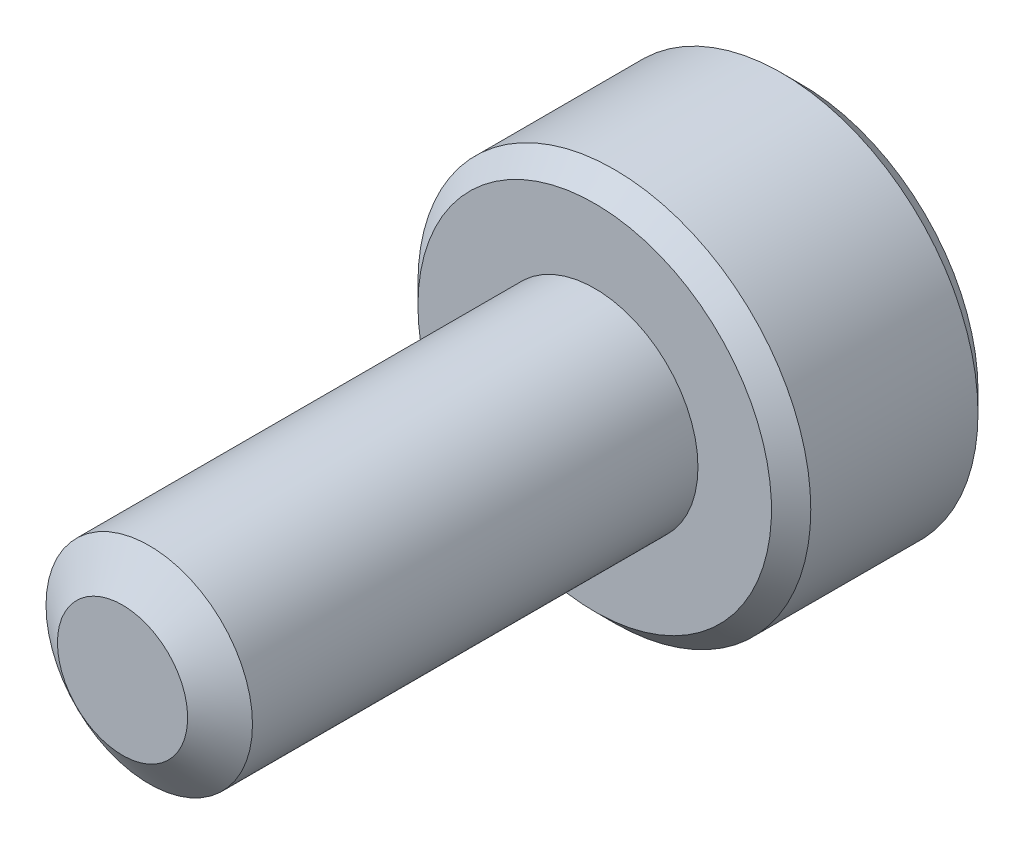
ISO-10303-21;
HEADER;
FILE_DESCRIPTION(('STEP AP214'),'2;1');
FILE_NAME('part.step','',(''),(''),'','','');
FILE_SCHEMA(('AUTOMOTIVE_DESIGN { 1 0 10303 214 1 1 1 1 }'));
ENDSEC;
DATA;
#1=APPLICATION_CONTEXT('core data for automotive mechanical design processes');
#2=APPLICATION_PROTOCOL_DEFINITION('international standard','automotive_design',2000,#1);
#3=PRODUCT_CONTEXT('',#1,'mechanical');
#4=PRODUCT('Part','Part','',(#3));
#5=PRODUCT_RELATED_PRODUCT_CATEGORY('part','',(#4));
#6=PRODUCT_DEFINITION_FORMATION('','',#4);
#7=PRODUCT_DEFINITION_CONTEXT('part definition',#1,'design');
#8=PRODUCT_DEFINITION('design','',#6,#7);
#9=PRODUCT_DEFINITION_SHAPE('','',#8);
#10=(LENGTH_UNIT() NAMED_UNIT(*) SI_UNIT(.MILLI.,.METRE.));
#11=(NAMED_UNIT(*) PLANE_ANGLE_UNIT() SI_UNIT($,.RADIAN.));
#12=(NAMED_UNIT(*) SI_UNIT($,.STERADIAN.) SOLID_ANGLE_UNIT());
#13=UNCERTAINTY_MEASURE_WITH_UNIT(LENGTH_MEASURE(1.E-05),#10,'distance_accuracy_value','');
#14=(GEOMETRIC_REPRESENTATION_CONTEXT(3) GLOBAL_UNCERTAINTY_ASSIGNED_CONTEXT((#13)) GLOBAL_UNIT_ASSIGNED_CONTEXT((#10,
#11,#12)) REPRESENTATION_CONTEXT('',''));
#15=CARTESIAN_POINT('',(0.,0.,0.));
#16=DIRECTION('',(0.,0.,1.));
#17=DIRECTION('',(1.,0.,0.));
#18=AXIS2_PLACEMENT_3D('',#15,#16,#17);
#19=CARTESIAN_POINT('',(0.,0.,-4.1656));
#20=DIRECTION('',(0.,0.,1.));
#21=DIRECTION('',(1.,0.,0.));
#22=AXIS2_PLACEMENT_3D('',#19,#20,#21);
#23=PLANE('',#22);
#24=CARTESIAN_POINT('',(0.,0.,-4.1656));
#25=DIRECTION('',(0.,0.,1.));
#26=DIRECTION('',(1.,0.,0.));
#27=AXIS2_PLACEMENT_3D('',#24,#25,#26);
#28=CIRCLE('',#27,3.56616);
#29=CARTESIAN_POINT('',(3.56616,0.,-4.1656));
#30=VERTEX_POINT('',#29);
#31=EDGE_CURVE('E11',#30,#30,#28,.F.);
#32=ORIENTED_EDGE('',*,*,#31,.T.);
#33=EDGE_LOOP('',(#32));
#34=FACE_BOUND('',#33,.T.);
#35=CARTESIAN_POINT('',(0.,0.,-4.1656));
#36=DIRECTION('',(0.,0.,-1.));
#37=DIRECTION('',(-1.,0.,0.));
#38=AXIS2_PLACEMENT_3D('',#35,#36,#37);
#39=CIRCLE('',#38,2.06222299276169);
#40=CARTESIAN_POINT('',(1.7859375,1.03111149638085,-4.1656));
#41=VERTEX_POINT('',#40);
#42=CARTESIAN_POINT('',(1.7859375,-1.03111149638085,-4.1656));
#43=VERTEX_POINT('',#42);
#44=EDGE_CURVE('E59',#41,#43,#39,.T.);
#45=ORIENTED_EDGE('',*,*,#44,.F.);
#46=CARTESIAN_POINT('',(0.,2.06222299276169,-4.1656));
#47=VERTEX_POINT('',#46);
#48=EDGE_CURVE('E135',#47,#41,#39,.T.);
#49=ORIENTED_EDGE('',*,*,#48,.F.);
#50=CARTESIAN_POINT('',(-1.7859375,1.03111149638085,-4.1656));
#51=VERTEX_POINT('',#50);
#52=EDGE_CURVE('E132',#51,#47,#39,.T.);
#53=ORIENTED_EDGE('',*,*,#52,.F.);
#54=CARTESIAN_POINT('',(-1.7859375,-1.03111149638085,-4.1656));
#55=VERTEX_POINT('',#54);
#56=EDGE_CURVE('E99',#55,#51,#39,.T.);
#57=ORIENTED_EDGE('',*,*,#56,.F.);
#58=CARTESIAN_POINT('',(0.,-2.06222299276169,-4.1656));
#59=VERTEX_POINT('',#58);
#60=EDGE_CURVE('E91',#59,#55,#39,.T.);
#61=ORIENTED_EDGE('',*,*,#60,.F.);
#62=EDGE_CURVE('E52',#43,#59,#39,.T.);
#63=ORIENTED_EDGE('',*,*,#62,.F.);
#64=EDGE_LOOP('',(#45,#49,#53,#57,#61,#63));
#65=FACE_BOUND('',#64,.T.);
#66=ADVANCED_FACE('F38',(#34,#65),#23,.F.);
#67=CARTESIAN_POINT('',(0.,0.,9.525));
#68=DIRECTION('',(0.,0.,-1.));
#69=DIRECTION('',(-1.,0.,0.));
#70=AXIS2_PLACEMENT_3D('',#67,#68,#69);
#71=CYLINDRICAL_SURFACE('',#70,2.0828);
#72=CARTESIAN_POINT('',(0.,0.,8.98615127117986));
#73=DIRECTION('',(0.,0.,-1.));
#74=DIRECTION('',(-1.,0.,0.));
#75=AXIS2_PLACEMENT_3D('',#72,#73,#74);
#76=CIRCLE('',#75,2.0828);
#77=CARTESIAN_POINT('',(-2.0828,0.,8.98615127117986));
#78=VERTEX_POINT('',#77);
#79=EDGE_CURVE('E167',#78,#78,#76,.T.);
#80=CARTESIAN_POINT('',(0.,0.,0.));
#81=DIRECTION('',(0.,0.,1.));
#82=DIRECTION('',(1.,0.,0.));
#83=AXIS2_PLACEMENT_3D('',#80,#81,#82);
#84=CIRCLE('',#83,2.0828);
#85=CARTESIAN_POINT('',(-2.0828,0.,0.));
#86=VERTEX_POINT('',#85);
#87=EDGE_CURVE('E166',#86,#86,#84,.T.);
#88=CARTESIAN_POINT('',(-2.0828,0.,8.98615127117986));
#89=CARTESIAN_POINT('',(-2.0828,0.,8.89254552877174));
#90=CARTESIAN_POINT('',(-2.0828,0.,8.79893978636361));
#91=CARTESIAN_POINT('',(-2.0828,0.,8.61172830154737));
#92=CARTESIAN_POINT('',(-2.0828,0.,8.51812255913924));
#93=CARTESIAN_POINT('',(-2.0828,0.,8.330911074323));
#94=CARTESIAN_POINT('',(-2.0828,0.,8.23730533191487));
#95=CARTESIAN_POINT('',(-2.0828,0.,8.05009384709862));
#96=CARTESIAN_POINT('',(-2.0828,0.,7.9564881046905));
#97=CARTESIAN_POINT('',(-2.0828,0.,7.76927661987425));
#98=CARTESIAN_POINT('',(-2.0828,0.,7.67567087746613));
#99=CARTESIAN_POINT('',(-2.0828,0.,7.48845939264988));
#100=CARTESIAN_POINT('',(-2.0828,0.,7.39485365024176));
#101=CARTESIAN_POINT('',(-2.0828,0.,7.20764216542551));
#102=CARTESIAN_POINT('',(-2.0828,0.,7.11403642301739));
#103=CARTESIAN_POINT('',(-2.0828,0.,6.92682493820114));
#104=CARTESIAN_POINT('',(-2.0828,0.,6.83321919579302));
#105=CARTESIAN_POINT('',(-2.0828,0.,6.64600771097677));
#106=CARTESIAN_POINT('',(-2.0828,0.,6.55240196856865));
#107=CARTESIAN_POINT('',(-2.0828,0.,6.3651904837524));
#108=CARTESIAN_POINT('',(-2.0828,0.,6.27158474134428));
#109=CARTESIAN_POINT('',(-2.0828,0.,6.08437325652803));
#110=CARTESIAN_POINT('',(-2.0828,0.,5.99076751411991));
#111=CARTESIAN_POINT('',(-2.0828,0.,5.80355602930366));
#112=CARTESIAN_POINT('',(-2.0828,0.,5.70995028689554));
#113=CARTESIAN_POINT('',(-2.0828,0.,5.52273880207929));
#114=CARTESIAN_POINT('',(-2.0828,0.,5.42913305967117));
#115=CARTESIAN_POINT('',(-2.0828,0.,5.24192157485492));
#116=CARTESIAN_POINT('',(-2.0828,0.,5.1483158324468));
#117=CARTESIAN_POINT('',(-2.0828,0.,4.96110434763055));
#118=CARTESIAN_POINT('',(-2.0828,0.,4.86749860522242));
#119=CARTESIAN_POINT('',(-2.0828,0.,4.68028712040618));
#120=CARTESIAN_POINT('',(-2.0828,0.,4.58668137799805));
#121=CARTESIAN_POINT('',(-2.0828,0.,4.39946989318181));
#122=CARTESIAN_POINT('',(-2.0828,0.,4.30586415077368));
#123=CARTESIAN_POINT('',(-2.0828,0.,4.11865266595744));
#124=CARTESIAN_POINT('',(-2.0828,0.,4.02504692354931));
#125=CARTESIAN_POINT('',(-2.0828,0.,3.83783543873307));
#126=CARTESIAN_POINT('',(-2.0828,0.,3.74422969632494));
#127=CARTESIAN_POINT('',(-2.0828,0.,3.55701821150869));
#128=CARTESIAN_POINT('',(-2.0828,0.,3.46341246910057));
#129=CARTESIAN_POINT('',(-2.0828,0.,3.27620098428432));
#130=CARTESIAN_POINT('',(-2.0828,0.,3.1825952418762));
#131=CARTESIAN_POINT('',(-2.0828,0.,2.99538375705995));
#132=CARTESIAN_POINT('',(-2.0828,0.,2.90177801465183));
#133=CARTESIAN_POINT('',(-2.0828,0.,2.71456652983558));
#134=CARTESIAN_POINT('',(-2.0828,0.,2.62096078742746));
#135=CARTESIAN_POINT('',(-2.0828,0.,2.43374930261121));
#136=CARTESIAN_POINT('',(-2.0828,0.,2.34014356020309));
#137=CARTESIAN_POINT('',(-2.0828,0.,2.15293207538684));
#138=CARTESIAN_POINT('',(-2.0828,0.,2.05932633297872));
#139=CARTESIAN_POINT('',(-2.0828,0.,1.87211484816247));
#140=CARTESIAN_POINT('',(-2.0828,0.,1.77850910575435));
#141=CARTESIAN_POINT('',(-2.0828,0.,1.5912976209381));
#142=CARTESIAN_POINT('',(-2.0828,0.,1.49769187852998));
#143=CARTESIAN_POINT('',(-2.0828,0.,1.31048039371373));
#144=CARTESIAN_POINT('',(-2.0828,0.,1.21687465130561));
#145=CARTESIAN_POINT('',(-2.0828,0.,1.02966316648936));
#146=CARTESIAN_POINT('',(-2.0828,0.,0.936057424081235));
#147=CARTESIAN_POINT('',(-2.0828,0.,0.748845939264988));
#148=CARTESIAN_POINT('',(-2.0828,0.,0.655240196856864));
#149=CARTESIAN_POINT('',(-2.0828,0.,0.468028712040617));
#150=CARTESIAN_POINT('',(-2.0828,0.,0.374422969632494));
#151=CARTESIAN_POINT('',(-2.0828,0.,0.187211484816247));
#152=CARTESIAN_POINT('',(-2.0828,0.,0.0936057424081236));
#153=CARTESIAN_POINT('',(-2.0828,0.,0.));
#154=B_SPLINE_CURVE_WITH_KNOTS('',3,(#88,#89,#90,#91,#92,#93,#94,#95,#96,#97,#98,#99,#100,#101,
#102,#103,#104,#105,#106,#107,#108,#109,#110,#111,#112,#113,#114,#115,#116,#117,#118,#119,#120,
#121,#122,#123,#124,#125,#126,#127,#128,#129,#130,#131,#132,#133,#134,#135,#136,#137,#138,#139,
#140,#141,#142,#143,#144,#145,#146,#147,#148,#149,#150,#151,#152,#153),.UNSPECIFIED.,.F.,.F.,(4,
2,2,2,2,2,2,2,2,2,2,2,2,2,2,2,2,2,2,2,2,2,2,2,2,2,2,2,2,2,2,2,4),(0.,0.28081722722437,
0.561634454448741,0.842451681673111,1.12326890889748,1.40408613612185,1.68490336334622,
1.96572059057059,2.24653781779496,2.52735504501933,2.80817227224371,3.08898949946808,
3.36980672669245,3.65062395391682,3.93144118114119,4.21225840836556,4.49307563558993,
4.7738928628143,5.05471009003867,5.33552731726304,5.61634454448741,5.89716177171178,
6.17797899893615,6.45879622616052,6.73961345338489,7.02043068060926,7.30124790783363,
7.58206513505801,7.86288236228238,8.14369958950675,8.42451681673112,8.70533404395549,
8.98615127117986),.UNSPECIFIED.);
#155=EDGE_CURVE('BSEAM233',#78,#86,#154,.T.);
#156=ORIENTED_EDGE('',*,*,#79,.T.);
#157=ORIENTED_EDGE('',*,*,#87,.T.);
#158=ORIENTED_EDGE('',*,*,#155,.T.);
#159=ORIENTED_EDGE('',*,*,#155,.F.);
#160=EDGE_LOOP('',(#156,#158,#157,#159));
#161=FACE_BOUND('',#160,.T.);
#162=ADVANCED_FACE('F233',(#161),#71,.T.);
#163=CARTESIAN_POINT('',(0.,0.,9.525));
#164=DIRECTION('',(0.,0.,-1.));
#165=DIRECTION('',(-1.,0.,0.));
#166=AXIS2_PLACEMENT_3D('',#163,#164,#165);
#167=CONICAL_SURFACE('',#166,1.313244262,0.959931088596877);
#168=ORIENTED_EDGE('',*,*,#79,.F.);
#169=EDGE_LOOP('',(#168));
#170=FACE_BOUND('',#169,.T.);
#171=CARTESIAN_POINT('',(0.,0.,9.525));
#172=DIRECTION('',(0.,0.,-1.));
#173=DIRECTION('',(-1.,0.,0.));
#174=AXIS2_PLACEMENT_3D('',#171,#172,#173);
#175=CIRCLE('',#174,1.313244262);
#176=CARTESIAN_POINT('',(-1.313244262,0.,9.525));
#177=VERTEX_POINT('',#176);
#178=EDGE_CURVE('E111',#177,#177,#175,.T.);
#179=ORIENTED_EDGE('',*,*,#178,.T.);
#180=EDGE_LOOP('',(#179));
#181=FACE_BOUND('',#180,.T.);
#182=ADVANCED_FACE('F243',(#170,#181),#167,.T.);
#183=CARTESIAN_POINT('',(0.,0.,9.525));
#184=DIRECTION('',(0.,0.,1.));
#185=DIRECTION('',(1.,0.,0.));
#186=AXIS2_PLACEMENT_3D('',#183,#184,#185);
#187=PLANE('',#186);
#188=ORIENTED_EDGE('',*,*,#178,.F.);
#189=EDGE_LOOP('',(#188));
#190=FACE_BOUND('',#189,.T.);
#191=ADVANCED_FACE('F241',(#190),#187,.T.);
#192=CARTESIAN_POINT('',(0.,0.,-4.1656));
#193=DIRECTION('',(0.,0.,1.));
#194=DIRECTION('',(1.,0.,0.));
#195=AXIS2_PLACEMENT_3D('',#192,#193,#194);
#196=CYLINDRICAL_SURFACE('',#195,3.9624);
#197=CARTESIAN_POINT('',(0.,0.,-0.396240000000008));
#198=DIRECTION('',(0.,0.,1.));
#199=DIRECTION('',(1.,0.,0.));
#200=AXIS2_PLACEMENT_3D('',#197,#198,#199);
#201=CIRCLE('',#200,3.9624);
#202=CARTESIAN_POINT('',(-3.9624,0.,-0.396240000000008));
#203=VERTEX_POINT('',#202);
#204=EDGE_CURVE('E46',#203,#203,#201,.F.);
#205=ORIENTED_EDGE('',*,*,#204,.T.);
#206=EDGE_LOOP('',(#205));
#207=FACE_BOUND('',#206,.T.);
#208=CARTESIAN_POINT('',(0.,0.,-3.76936));
#209=DIRECTION('',(0.,0.,1.));
#210=DIRECTION('',(1.,0.,0.));
#211=AXIS2_PLACEMENT_3D('',#208,#209,#210);
#212=CIRCLE('',#211,3.9624);
#213=CARTESIAN_POINT('',(3.9624,0.,-3.76936));
#214=VERTEX_POINT('',#213);
#215=EDGE_CURVE('E263',#214,#214,#212,.T.);
#216=ORIENTED_EDGE('',*,*,#215,.T.);
#217=EDGE_LOOP('',(#216));
#218=FACE_BOUND('',#217,.T.);
#219=ADVANCED_FACE('F237',(#207,#218),#196,.T.);
#220=CARTESIAN_POINT('',(0.,0.,0.));
#221=DIRECTION('',(0.,0.,1.));
#222=DIRECTION('',(1.,0.,0.));
#223=AXIS2_PLACEMENT_3D('',#220,#221,#222);
#224=PLANE('',#223);
#225=CARTESIAN_POINT('',(0.,0.,0.));
#226=DIRECTION('',(0.,0.,1.));
#227=DIRECTION('',(1.,0.,0.));
#228=AXIS2_PLACEMENT_3D('',#225,#226,#227);
#229=CIRCLE('',#228,3.56615999999999);
#230=CARTESIAN_POINT('',(-3.56615999999999,0.,0.));
#231=VERTEX_POINT('',#230);
#232=EDGE_CURVE('E110',#231,#231,#229,.T.);
#233=ORIENTED_EDGE('',*,*,#232,.T.);
#234=EDGE_LOOP('',(#233));
#235=FACE_BOUND('',#234,.T.);
#236=ORIENTED_EDGE('',*,*,#87,.F.);
#237=EDGE_LOOP('',(#236));
#238=FACE_BOUND('',#237,.T.);
#239=ADVANCED_FACE('F187',(#235,#238),#224,.T.);
#240=CARTESIAN_POINT('',(0.,0.,-4.1656));
#241=DIRECTION('',(0.,0.,-1.));
#242=DIRECTION('',(-1.,0.,0.));
#243=AXIS2_PLACEMENT_3D('',#240,#241,#242);
#244=CONICAL_SURFACE('',#243,2.06222299276169,0.78539816339745);
#245=CARTESIAN_POINT('',(-1.7859375,3.94773522138207,-6.43629590009179));
#246=CARTESIAN_POINT('',(-1.7859375,3.83202346517852,-6.33090281904239));
#247=CARTESIAN_POINT('',(-1.7859375,3.71594711704961,-6.22590363843143));
#248=CARTESIAN_POINT('',(-1.7859375,3.48276087739173,-6.01699918838669));
#249=CARTESIAN_POINT('',(-1.7859375,3.36565072576852,-5.91309420954707));
#250=CARTESIAN_POINT('',(-1.7859375,3.12925899916495,-5.70595657207523));
#251=CARTESIAN_POINT('',(-1.7859375,3.00996769123574,-5.60273499264389));
#252=CARTESIAN_POINT('',(-1.7859375,2.76967712445544,-5.39832437310798));
#253=CARTESIAN_POINT('',(-1.7859375,2.64867810221676,-5.29713505604056));
#254=CARTESIAN_POINT('',(-1.7859375,2.42185288532481,-5.11191465656216));
#255=CARTESIAN_POINT('',(-1.7859375,2.31633818033951,-5.02750335078105));
#256=CARTESIAN_POINT('',(-1.7859375,2.10303633574271,-4.86160599622489));
#257=CARTESIAN_POINT('',(-1.7859375,1.99524945235304,-4.78011962039188));
#258=CARTESIAN_POINT('',(-1.7859375,1.77674630506507,-4.62146288230068));
#259=CARTESIAN_POINT('',(-1.7859375,1.6660341765784,-4.54428686189888));
#260=CARTESIAN_POINT('',(-1.7859375,1.4404785436667,-4.39625129984153));
#261=CARTESIAN_POINT('',(-1.7859375,1.32563792538001,-4.32538746152534));
#262=CARTESIAN_POINT('',(-1.7859375,1.15102922380501,-4.22758122271008));
#263=CARTESIAN_POINT('',(-1.7859375,1.09340720665522,-4.19683706330045));
#264=CARTESIAN_POINT('',(-1.7859375,0.976687400374683,-4.1383043715416));
#265=CARTESIAN_POINT('',(-1.7859375,0.917589333563426,-4.11051640057335));
#266=CARTESIAN_POINT('',(-1.7859375,0.738002241313431,-4.03278516550804));
#267=CARTESIAN_POINT('',(-1.7859375,0.614930702790444,-3.98830400058563));
#268=CARTESIAN_POINT('',(-1.7859375,0.437640235307517,-3.94148797367324));
#269=CARTESIAN_POINT('',(-1.7859375,0.385852005718773,-3.92979967944227));
#270=CARTESIAN_POINT('',(-1.7859375,0.281510077591438,-3.9106388510091));
#271=CARTESIAN_POINT('',(-1.7859375,0.228956772904485,-3.90316422126354));
#272=CARTESIAN_POINT('',(-1.7859375,0.123491019785464,-3.89281121761818));
#273=CARTESIAN_POINT('',(-1.7859375,0.0705794002841838,-3.88992449323661));
#274=CARTESIAN_POINT('',(-1.7859375,-0.0352924234374902,-3.88887881910353));
#275=CARTESIAN_POINT('',(-1.7859375,-0.0882526282013359,-3.89071992289603));
#276=CARTESIAN_POINT('',(-1.7859375,-0.193671798862641,-3.89901781858212));
#277=CARTESIAN_POINT('',(-1.7859375,-0.246131683183514,-3.90546313133612));
#278=CARTESIAN_POINT('',(-1.7859375,-0.350349691590378,-3.92262779716619));
#279=CARTESIAN_POINT('',(-1.7859375,-0.402107650818739,-3.93334813691752));
#280=CARTESIAN_POINT('',(-1.7859375,-0.504812383457729,-3.9586188886344));
#281=CARTESIAN_POINT('',(-1.7859375,-0.555756676033843,-3.97317926263838));
#282=CARTESIAN_POINT('',(-1.7859375,-0.656575010161415,-4.00558205993048));
#283=CARTESIAN_POINT('',(-1.7859375,-0.706449106266951,-4.02342431547625));
#284=CARTESIAN_POINT('',(-1.7859375,-0.822885227202578,-4.06880068197002));
#285=CARTESIAN_POINT('',(-1.7859375,-0.888987191250802,-4.09751084235454));
#286=CARTESIAN_POINT('',(-1.7859375,-1.01932169626022,-4.15892634782072));
#287=CARTESIAN_POINT('',(-1.7859375,-1.08355322655978,-4.19163380494169));
#288=CARTESIAN_POINT('',(-1.7859375,-1.21045400591296,-4.26020680274392));
#289=CARTESIAN_POINT('',(-1.7859375,-1.27312003060242,-4.29607826625165));
#290=CARTESIAN_POINT('',(-1.7859375,-1.39700140938869,-4.37025415010389));
#291=CARTESIAN_POINT('',(-1.7859375,-1.45821646672893,-4.40855906234929));
#292=CARTESIAN_POINT('',(-1.7859375,-1.64128044878836,-4.52713710609297));
#293=CARTESIAN_POINT('',(-1.7859375,-1.76123145239006,-4.61033367585576));
#294=CARTESIAN_POINT('',(-1.7859375,-1.99737773319451,-4.78153691299327));
#295=CARTESIAN_POINT('',(-1.7859375,-2.11357709845316,-4.86953804266749));
#296=CARTESIAN_POINT('',(-1.7859375,-2.37980416915076,-5.07727068877242));
#297=CARTESIAN_POINT('',(-1.7859375,-2.528879546097,-5.19821810302292));
#298=CARTESIAN_POINT('',(-1.7859375,-2.82407069193545,-5.44378006534443));
#299=CARTESIAN_POINT('',(-1.7859375,-2.97018499239972,-5.5683963611831));
#300=CARTESIAN_POINT('',(-1.7859375,-3.2556922354996,-5.81608936481365));
#301=CARTESIAN_POINT('',(-1.7859375,-3.39515148627287,-5.93908982694195));
#302=CARTESIAN_POINT('',(-1.7859375,-3.60318980210445,-6.12476752360082));
#303=CARTESIAN_POINT('',(-1.7859375,-3.67231785802155,-6.18683223017226));
#304=CARTESIAN_POINT('',(-1.7859375,-3.81025429122559,-6.31131352417945));
#305=CARTESIAN_POINT('',(-1.7859375,-3.87906267412354,-6.37373010539608));
#306=CARTESIAN_POINT('',(-1.7859375,-3.94773522138207,-6.43629590009179));
#307=B_SPLINE_CURVE_WITH_KNOTS('',3,(#245,#246,#247,#248,#249,#250,#251,#252,#253,#254,#255,
#256,#257,#258,#259,#260,#261,#262,#263,#264,#265,#266,#267,#268,#269,#270,#271,#272,#273,#274,
#275,#276,#277,#278,#279,#280,#281,#282,#283,#284,#285,#286,#287,#288,#289,#290,#291,#292,#293,
#294,#295,#296,#297,#298,#299,#300,#301,#302,#303,#304,#305,#306),.UNSPECIFIED.,.F.,.F.,(4,2,2,
2,2,2,2,2,2,2,2,2,2,2,2,2,2,2,2,2,2,2,2,2,2,2,2,2,2,2,4),(0.,0.4695502940433,0.939222294724769,
1.41245712670191,1.88562702106666,2.29096610385502,2.69625972060174,3.10100816636198,
3.50547896283786,3.70132898903165,3.89721614105621,4.28798635965062,4.44711950157508,
4.60617343328885,4.764937536816,4.92370343840017,5.08207488274289,5.24048290035388,
5.39930598214365,5.55812094847986,5.77414260076801,5.99027888925184,6.20682872540187,
6.42342247540149,6.8611315687681,7.29834639621524,7.87414904308733,8.45023057430211,
9.0080661840056,9.2867703129156,9.56546953128527),.UNSPECIFIED.);
#308=EDGE_CURVE('E104',#51,#55,#307,.T.);
#309=ORIENTED_EDGE('',*,*,#308,.T.);
#310=ORIENTED_EDGE('',*,*,#56,.T.);
#311=EDGE_LOOP('',(#309,#310));
#312=FACE_BOUND('',#311,.T.);
#313=ADVANCED_FACE('F105',(#312),#244,.F.);
#314=CARTESIAN_POINT('',(0.000199999999999458,2.06233846281553,-4.16571547975157));
#315=CARTESIAN_POINT('',(-0.0611956015759157,2.02689169571862,-4.13029683020531));
#316=CARTESIAN_POINT('',(-0.123617860874081,1.9908521875094,-4.09695817815087));
#317=CARTESIAN_POINT('',(-0.25090396053589,1.91736352360556,-4.03591555920549));
#318=CARTESIAN_POINT('',(-0.315779909798268,1.87990737683499,-4.00824556212514));
#319=CARTESIAN_POINT('',(-0.446599209311714,1.8043788190457,-3.96084612655275));
#320=CARTESIAN_POINT('',(-0.512509233513533,1.76632564883049,-3.94099753428611));
#321=CARTESIAN_POINT('',(-0.645780477682401,1.68938146013436,-3.91041648161427));
#322=CARTESIAN_POINT('',(-0.713137624857635,1.65049279308089,-3.89966118864122));
#323=CARTESIAN_POINT('',(-0.829220820670577,1.5834721287299,-3.88995725595888));
#324=CARTESIAN_POINT('',(-0.877796848686671,1.55542674587864,-3.88852054545305));
#325=CARTESIAN_POINT('',(-0.974869540343765,1.49938180121946,-3.89093944778875));
#326=CARTESIAN_POINT('',(-1.02336617019129,1.4713822589222,-3.89479691617145));
#327=CARTESIAN_POINT('',(-1.11988817846821,1.4156552514608,-3.90758288274392));
#328=CARTESIAN_POINT('',(-1.16791312509815,1.38792803559618,-3.91651565371546));
#329=CARTESIAN_POINT('',(-1.26315922323818,1.33293767519577,-3.93896731414222));
#330=CARTESIAN_POINT('',(-1.31037998091306,1.30567475804084,-3.95248838643804));
#331=CARTESIAN_POINT('',(-1.43132294865621,1.23584830305774,-3.99262737463409));
#332=CARTESIAN_POINT('',(-1.50429529371242,1.19371769999614,-4.02227078390693));
#333=CARTESIAN_POINT('',(-1.61159442773943,1.13176851608183,-4.07231349025403));
#334=CARTESIAN_POINT('',(-1.64695424171411,1.11135351796506,-4.08989628377396));
#335=CARTESIAN_POINT('',(-1.71701878052223,1.07090173762355,-4.12666476914807));
#336=CARTESIAN_POINT('',(-1.75172389195438,1.05086473219594,-4.14584947628896));
#337=CARTESIAN_POINT('',(-1.7861375,1.03099602632701,-4.16571547975157));
#338=B_SPLINE_CURVE_WITH_KNOTS('',3,(#314,#315,#316,#317,#318,#319,#320,#321,#322,#323,#324,
#325,#326,#327,#328,#329,#330,#331,#332,#333,#334,#335,#336,#337),.UNSPECIFIED.,.F.,.F.,(4,2,2,
2,2,2,2,2,2,2,2,4),(0.,0.2379111404238,0.477208767673628,0.712705150046277,0.947608448198472,
1.11569769827263,1.28384587649986,1.45213582505427,1.62050594845156,1.88791495712909,
2.02125696737758,2.15451760593925),.UNSPECIFIED.);
#339=EDGE_CURVE('E134',#47,#51,#338,.T.);
#340=ORIENTED_EDGE('',*,*,#339,.T.);
#341=ORIENTED_EDGE('',*,*,#52,.T.);
#342=EDGE_LOOP('',(#340,#341));
#343=FACE_BOUND('',#342,.T.);
#344=ADVANCED_FACE('F186',(#343),#244,.F.);
#345=CARTESIAN_POINT('',(1.7861375,1.03099602632701,-4.16571547975157));
#346=CARTESIAN_POINT('',(1.72474189842408,1.06644279342392,-4.13029683020531));
#347=CARTESIAN_POINT('',(1.66231963912592,1.10248230163314,-4.09695817815087));
#348=CARTESIAN_POINT('',(1.53503353946411,1.17597096553699,-4.03591555920549));
#349=CARTESIAN_POINT('',(1.47015759020173,1.21342711230755,-4.00824556212513));
#350=CARTESIAN_POINT('',(1.33933829068829,1.28895567009684,-3.96084612655275));
#351=CARTESIAN_POINT('',(1.27342826648647,1.32700884031206,-3.9409975342861));
#352=CARTESIAN_POINT('',(1.1401570223176,1.40395302900819,-3.91041648161427));
#353=CARTESIAN_POINT('',(1.07279987514236,1.44284169606165,-3.89966118864122));
#354=CARTESIAN_POINT('',(0.956716679329422,1.50986236041265,-3.88995725595888));
#355=CARTESIAN_POINT('',(0.908140651313328,1.5379077432639,-3.88852054545305));
#356=CARTESIAN_POINT('',(0.811067959656234,1.59395268792309,-3.89093944778875));
#357=CARTESIAN_POINT('',(0.76257132980871,1.62195223022035,-3.89479691617145));
#358=CARTESIAN_POINT('',(0.666049321531793,1.67767923768175,-3.90758288274392));
#359=CARTESIAN_POINT('',(0.618024374901853,1.70540645354636,-3.91651565371546));
#360=CARTESIAN_POINT('',(0.522778276761815,1.76039681394677,-3.93896731414222));
#361=CARTESIAN_POINT('',(0.475557519086936,1.7876597311017,-3.95248838643804));
#362=CARTESIAN_POINT('',(0.354614551343789,1.8574861860848,-3.99262737463409));
#363=CARTESIAN_POINT('',(0.281642206287576,1.8996167891464,-4.02227078390693));
#364=CARTESIAN_POINT('',(0.174343072260568,1.96156597306071,-4.07231349025403));
#365=CARTESIAN_POINT('',(0.138983258285891,1.98198097117748,-4.08989628377396));
#366=CARTESIAN_POINT('',(0.068918719477774,2.022432751519,-4.12666476914807));
#367=CARTESIAN_POINT('',(0.0342136080456207,2.04246975694661,-4.14584947628896));
#368=CARTESIAN_POINT('',(-0.000200000000000328,2.06233846281553,-4.16571547975157));
#369=B_SPLINE_CURVE_WITH_KNOTS('',3,(#345,#346,#347,#348,#349,#350,#351,#352,#353,#354,#355,
#356,#357,#358,#359,#360,#361,#362,#363,#364,#365,#366,#367,#368),.UNSPECIFIED.,.F.,.F.,(4,2,2,
2,2,2,2,2,2,2,2,4),(0.,0.237911140423801,0.477208767673629,0.712705150046279,0.947608448198474,
1.11569769827263,1.28384587649986,1.45213582505427,1.62050594845156,1.88791495712909,
2.02125696737758,2.15451760593925),.UNSPECIFIED.);
#370=EDGE_CURVE('E138',#41,#47,#369,.T.);
#371=ORIENTED_EDGE('',*,*,#370,.T.);
#372=ORIENTED_EDGE('',*,*,#48,.T.);
#373=EDGE_LOOP('',(#371,#372));
#374=FACE_BOUND('',#373,.T.);
#375=ADVANCED_FACE('F141',(#374),#244,.F.);
#376=CARTESIAN_POINT('',(1.7859375,-3.94773522138206,-6.43629590009179));
#377=CARTESIAN_POINT('',(1.7859375,-3.83202346517852,-6.33090281904239));
#378=CARTESIAN_POINT('',(1.7859375,-3.71594711704961,-6.22590363843142));
#379=CARTESIAN_POINT('',(1.7859375,-3.48276087739173,-6.01699918838668));
#380=CARTESIAN_POINT('',(1.7859375,-3.36565072576852,-5.91309420954706));
#381=CARTESIAN_POINT('',(1.7859375,-3.12925899916495,-5.70595657207523));
#382=CARTESIAN_POINT('',(1.7859375,-3.00996769123573,-5.60273499264389));
#383=CARTESIAN_POINT('',(1.7859375,-2.76967712445544,-5.39832437310797));
#384=CARTESIAN_POINT('',(1.7859375,-2.64867810221676,-5.29713505604056));
#385=CARTESIAN_POINT('',(1.7859375,-2.42185288532481,-5.11191465656217));
#386=CARTESIAN_POINT('',(1.7859375,-2.31633818033951,-5.02750335078105));
#387=CARTESIAN_POINT('',(1.7859375,-2.10303633574271,-4.86160599622489));
#388=CARTESIAN_POINT('',(1.7859375,-1.99524945235304,-4.78011962039188));
#389=CARTESIAN_POINT('',(1.7859375,-1.77674630506507,-4.62146288230068));
#390=CARTESIAN_POINT('',(1.7859375,-1.6660341765784,-4.54428686189888));
#391=CARTESIAN_POINT('',(1.7859375,-1.4404785436667,-4.39625129984153));
#392=CARTESIAN_POINT('',(1.7859375,-1.32563792538001,-4.32538746152534));
#393=CARTESIAN_POINT('',(1.7859375,-1.15102922380501,-4.22758122271008));
#394=CARTESIAN_POINT('',(1.7859375,-1.09340720665522,-4.19683706330045));
#395=CARTESIAN_POINT('',(1.7859375,-0.976687400374684,-4.1383043715416));
#396=CARTESIAN_POINT('',(1.7859375,-0.917589333563427,-4.11051640057335));
#397=CARTESIAN_POINT('',(1.7859375,-0.738002241313432,-4.03278516550804));
#398=CARTESIAN_POINT('',(1.7859375,-0.614930702790446,-3.98830400058563));
#399=CARTESIAN_POINT('',(1.7859375,-0.437640235307518,-3.94148797367324));
#400=CARTESIAN_POINT('',(1.7859375,-0.385852005718775,-3.92979967944227));
#401=CARTESIAN_POINT('',(1.7859375,-0.281510077591439,-3.9106388510091));
#402=CARTESIAN_POINT('',(1.7859375,-0.228956772904487,-3.90316422126354));
#403=CARTESIAN_POINT('',(1.7859375,-0.123491019785465,-3.89281121761818));
#404=CARTESIAN_POINT('',(1.7859375,-0.0705794002841852,-3.88992449323661));
#405=CARTESIAN_POINT('',(1.7859375,0.0352924234374888,-3.88887881910353));
#406=CARTESIAN_POINT('',(1.7859375,0.0882526282013345,-3.89071992289603));
#407=CARTESIAN_POINT('',(1.7859375,0.19367179886264,-3.89901781858212));
#408=CARTESIAN_POINT('',(1.7859375,0.246131683183513,-3.90546313133612));
#409=CARTESIAN_POINT('',(1.7859375,0.350349691590377,-3.92262779716619));
#410=CARTESIAN_POINT('',(1.7859375,0.402107650818739,-3.93334813691752));
#411=CARTESIAN_POINT('',(1.7859375,0.504812383457728,-3.9586188886344));
#412=CARTESIAN_POINT('',(1.7859375,0.555756676033842,-3.97317926263838));
#413=CARTESIAN_POINT('',(1.7859375,0.656575010161413,-4.00558205993048));
#414=CARTESIAN_POINT('',(1.7859375,0.70644910626695,-4.02342431547625));
#415=CARTESIAN_POINT('',(1.7859375,0.822885227202576,-4.06880068197002));
#416=CARTESIAN_POINT('',(1.7859375,0.8889871912508,-4.09751084235454));
#417=CARTESIAN_POINT('',(1.7859375,1.01932169626022,-4.15892634782071));
#418=CARTESIAN_POINT('',(1.7859375,1.08355322655978,-4.19163380494168));
#419=CARTESIAN_POINT('',(1.7859375,1.21045400591295,-4.26020680274392));
#420=CARTESIAN_POINT('',(1.7859375,1.27312003060242,-4.29607826625165));
#421=CARTESIAN_POINT('',(1.7859375,1.39700140938868,-4.37025415010389));
#422=CARTESIAN_POINT('',(1.7859375,1.45821646672892,-4.40855906234929));
#423=CARTESIAN_POINT('',(1.7859375,1.64128044878836,-4.52713710609297));
#424=CARTESIAN_POINT('',(1.7859375,1.76123145239006,-4.61033367585576));
#425=CARTESIAN_POINT('',(1.7859375,1.9973777331945,-4.78153691299327));
#426=CARTESIAN_POINT('',(1.7859375,2.11357709845316,-4.86953804266749));
#427=CARTESIAN_POINT('',(1.7859375,2.37980416915076,-5.07727068877242));
#428=CARTESIAN_POINT('',(1.7859375,2.528879546097,-5.19821810302292));
#429=CARTESIAN_POINT('',(1.7859375,2.82407069193544,-5.44378006534443));
#430=CARTESIAN_POINT('',(1.7859375,2.97018499239972,-5.5683963611831));
#431=CARTESIAN_POINT('',(1.7859375,3.2556922354996,-5.81608936481365));
#432=CARTESIAN_POINT('',(1.7859375,3.39515148627287,-5.93908982694195));
#433=CARTESIAN_POINT('',(1.7859375,3.60318980210445,-6.12476752360082));
#434=CARTESIAN_POINT('',(1.7859375,3.67231785802155,-6.18683223017226));
#435=CARTESIAN_POINT('',(1.7859375,3.81025429122559,-6.31131352417945));
#436=CARTESIAN_POINT('',(1.7859375,3.87906267412354,-6.37373010539608));
#437=CARTESIAN_POINT('',(1.7859375,3.94773522138207,-6.43629590009179));
#438=B_SPLINE_CURVE_WITH_KNOTS('',3,(#376,#377,#378,#379,#380,#381,#382,#383,#384,#385,#386,
#387,#388,#389,#390,#391,#392,#393,#394,#395,#396,#397,#398,#399,#400,#401,#402,#403,#404,#405,
#406,#407,#408,#409,#410,#411,#412,#413,#414,#415,#416,#417,#418,#419,#420,#421,#422,#423,#424,
#425,#426,#427,#428,#429,#430,#431,#432,#433,#434,#435,#436,#437),.UNSPECIFIED.,.F.,.F.,(4,2,2,
2,2,2,2,2,2,2,2,2,2,2,2,2,2,2,2,2,2,2,2,2,2,2,2,2,2,2,4),(0.,0.4695502940433,0.939222294724768,
1.41245712670191,1.88562702106666,2.29096610385501,2.69625972060173,3.10100816636197,
3.50547896283785,3.70132898903165,3.89721614105621,4.28798635965062,4.44711950157508,
4.60617343328884,4.764937536816,4.92370343840016,5.08207488274289,5.24048290035387,
5.39930598214364,5.55812094847986,5.774142600768,5.99027888925184,6.20682872540186,
6.42342247540149,6.86113156876809,7.29834639621523,7.87414904308733,8.45023057430211,
9.0080661840056,9.2867703129156,9.56546953128527),.UNSPECIFIED.);
#439=EDGE_CURVE('E147',#43,#41,#438,.T.);
#440=ORIENTED_EDGE('',*,*,#439,.T.);
#441=ORIENTED_EDGE('',*,*,#44,.T.);
#442=EDGE_LOOP('',(#440,#441));
#443=FACE_BOUND('',#442,.T.);
#444=ADVANCED_FACE('F357',(#443),#244,.F.);
#445=CARTESIAN_POINT('',(-0.000200000000000434,-2.06233846281553,-4.16571547975157));
#446=CARTESIAN_POINT('',(0.0611956015759149,-2.02689169571862,-4.13029683020531));
#447=CARTESIAN_POINT('',(0.123617860874081,-1.9908521875094,-4.09695817815087));
#448=CARTESIAN_POINT('',(0.25090396053589,-1.91736352360556,-4.03591555920549));
#449=CARTESIAN_POINT('',(0.315779909798268,-1.87990737683499,-4.00824556212513));
#450=CARTESIAN_POINT('',(0.446599209311714,-1.8043788190457,-3.96084612655275));
#451=CARTESIAN_POINT('',(0.512509233513533,-1.76632564883049,-3.9409975342861));
#452=CARTESIAN_POINT('',(0.645780477682402,-1.68938146013435,-3.91041648161427));
#453=CARTESIAN_POINT('',(0.713137624857636,-1.65049279308089,-3.89966118864122));
#454=CARTESIAN_POINT('',(0.829220820670578,-1.58347212872989,-3.88995725595888));
#455=CARTESIAN_POINT('',(0.877796848686672,-1.55542674587864,-3.88852054545305));
#456=CARTESIAN_POINT('',(0.974869540343766,-1.49938180121945,-3.89093944778875));
#457=CARTESIAN_POINT('',(1.02336617019129,-1.4713822589222,-3.89479691617145));
#458=CARTESIAN_POINT('',(1.11988817846821,-1.4156552514608,-3.90758288274392));
#459=CARTESIAN_POINT('',(1.16791312509815,-1.38792803559618,-3.91651565371546));
#460=CARTESIAN_POINT('',(1.26315922323819,-1.33293767519577,-3.93896731414222));
#461=CARTESIAN_POINT('',(1.31037998091306,-1.30567475804084,-3.95248838643804));
#462=CARTESIAN_POINT('',(1.43132294865621,-1.23584830305774,-3.99262737463409));
#463=CARTESIAN_POINT('',(1.50429529371242,-1.19371769999614,-4.02227078390693));
#464=CARTESIAN_POINT('',(1.61159442773943,-1.13176851608183,-4.07231349025403));
#465=CARTESIAN_POINT('',(1.64695424171411,-1.11135351796506,-4.08989628377396));
#466=CARTESIAN_POINT('',(1.71701878052223,-1.07090173762354,-4.12666476914807));
#467=CARTESIAN_POINT('',(1.75172389195438,-1.05086473219594,-4.14584947628896));
#468=CARTESIAN_POINT('',(1.7861375,-1.03099602632701,-4.16571547975157));
#469=B_SPLINE_CURVE_WITH_KNOTS('',3,(#445,#446,#447,#448,#449,#450,#451,#452,#453,#454,#455,
#456,#457,#458,#459,#460,#461,#462,#463,#464,#465,#466,#467,#468),.UNSPECIFIED.,.F.,.F.,(4,2,2,
2,2,2,2,2,2,2,2,4),(0.,0.237911140423801,0.477208767673629,0.712705150046279,0.947608448198475,
1.11569769827263,1.28384587649987,1.45213582505427,1.62050594845156,1.88791495712909,
2.02125696737758,2.15451760593925),.UNSPECIFIED.);
#470=EDGE_CURVE('E123',#59,#43,#469,.T.);
#471=ORIENTED_EDGE('',*,*,#470,.T.);
#472=ORIENTED_EDGE('',*,*,#62,.T.);
#473=EDGE_LOOP('',(#471,#472));
#474=FACE_BOUND('',#473,.T.);
#475=ADVANCED_FACE('F349',(#474),#244,.F.);
#476=CARTESIAN_POINT('',(-1.7861375,-1.03099602632701,-4.16571547975157));
#477=CARTESIAN_POINT('',(-1.72474189842408,-1.06644279342392,-4.13029683020531));
#478=CARTESIAN_POINT('',(-1.66231963912592,-1.10248230163314,-4.09695817815087));
#479=CARTESIAN_POINT('',(-1.53503353946411,-1.17597096553699,-4.03591555920549));
#480=CARTESIAN_POINT('',(-1.47015759020173,-1.21342711230755,-4.00824556212513));
#481=CARTESIAN_POINT('',(-1.33933829068829,-1.28895567009684,-3.96084612655275));
#482=CARTESIAN_POINT('',(-1.27342826648647,-1.32700884031206,-3.9409975342861));
#483=CARTESIAN_POINT('',(-1.1401570223176,-1.40395302900819,-3.91041648161427));
#484=CARTESIAN_POINT('',(-1.07279987514236,-1.44284169606165,-3.89966118864122));
#485=CARTESIAN_POINT('',(-0.956716679329422,-1.50986236041265,-3.88995725595888));
#486=CARTESIAN_POINT('',(-0.908140651313328,-1.5379077432639,-3.88852054545305));
#487=CARTESIAN_POINT('',(-0.811067959656235,-1.59395268792309,-3.89093944778875));
#488=CARTESIAN_POINT('',(-0.762571329808711,-1.62195223022035,-3.89479691617145));
#489=CARTESIAN_POINT('',(-0.666049321531795,-1.67767923768175,-3.90758288274392));
#490=CARTESIAN_POINT('',(-0.618024374901854,-1.70540645354636,-3.91651565371546));
#491=CARTESIAN_POINT('',(-0.522778276761816,-1.76039681394677,-3.93896731414222));
#492=CARTESIAN_POINT('',(-0.475557519086938,-1.7876597311017,-3.95248838643804));
#493=CARTESIAN_POINT('',(-0.35461455134379,-1.8574861860848,-3.99262737463409));
#494=CARTESIAN_POINT('',(-0.281642206287577,-1.8996167891464,-4.02227078390693));
#495=CARTESIAN_POINT('',(-0.174343072260569,-1.96156597306071,-4.07231349025403));
#496=CARTESIAN_POINT('',(-0.138983258285892,-1.98198097117748,-4.08989628377396));
#497=CARTESIAN_POINT('',(-0.0689187194777749,-2.022432751519,-4.12666476914807));
#498=CARTESIAN_POINT('',(-0.0342136080456218,-2.04246975694661,-4.14584947628896));
#499=CARTESIAN_POINT('',(0.000199999999999393,-2.06233846281553,-4.16571547975157));
#500=B_SPLINE_CURVE_WITH_KNOTS('',3,(#476,#477,#478,#479,#480,#481,#482,#483,#484,#485,#486,
#487,#488,#489,#490,#491,#492,#493,#494,#495,#496,#497,#498,#499),.UNSPECIFIED.,.F.,.F.,(4,2,2,
2,2,2,2,2,2,2,2,4),(0.,0.2379111404238,0.477208767673628,0.712705150046277,0.947608448198473,
1.11569769827263,1.28384587649986,1.45213582505427,1.62050594845156,1.88791495712909,
2.02125696737758,2.15451760593925),.UNSPECIFIED.);
#501=EDGE_CURVE('E95',#55,#59,#500,.T.);
#502=ORIENTED_EDGE('',*,*,#501,.T.);
#503=ORIENTED_EDGE('',*,*,#60,.T.);
#504=EDGE_LOOP('',(#502,#503));
#505=FACE_BOUND('',#504,.T.);
#506=ADVANCED_FACE('F93',(#505),#244,.F.);
#507=CARTESIAN_POINT('',(0.,0.,-1.48669375));
#508=DIRECTION('',(0.,0.,1.));
#509=DIRECTION('',(1.,0.,0.));
#510=AXIS2_PLACEMENT_3D('',#507,#508,#509);
#511=PLANE('',#510);
#512=DIRECTION('',(0.866025403784439,-0.5,0.));
#513=VECTOR('',#512,1.);
#514=CARTESIAN_POINT('',(-0.89296875,-1.54666724457127,-1.48669375));
#515=LINE('',#514,#513);
#516=CARTESIAN_POINT('',(-1.7859375,-1.03111149638085,-1.48669375));
#517=VERTEX_POINT('',#516);
#518=CARTESIAN_POINT('',(0.,-2.06222299276169,-1.48669375));
#519=VERTEX_POINT('',#518);
#520=EDGE_CURVE('E122',#517,#519,#515,.T.);
#521=ORIENTED_EDGE('',*,*,#520,.F.);
#522=DIRECTION('',(0.,-1.,0.));
#523=VECTOR('',#522,1.);
#524=CARTESIAN_POINT('',(-1.7859375,0.,-1.48669375));
#525=LINE('',#524,#523);
#526=CARTESIAN_POINT('',(-1.7859375,1.03111149638085,-1.48669375));
#527=VERTEX_POINT('',#526);
#528=EDGE_CURVE('E127',#527,#517,#525,.T.);
#529=ORIENTED_EDGE('',*,*,#528,.F.);
#530=DIRECTION('',(-0.866025403784439,-0.5,0.));
#531=VECTOR('',#530,1.);
#532=CARTESIAN_POINT('',(-0.89296875,1.54666724457127,-1.48669375));
#533=LINE('',#532,#531);
#534=CARTESIAN_POINT('',(0.,2.06222299276169,-1.48669375));
#535=VERTEX_POINT('',#534);
#536=EDGE_CURVE('E417',#535,#527,#533,.T.);
#537=ORIENTED_EDGE('',*,*,#536,.F.);
#538=DIRECTION('',(-0.866025403784439,0.5,0.));
#539=VECTOR('',#538,1.);
#540=CARTESIAN_POINT('',(0.89296875,1.54666724457127,-1.48669375));
#541=LINE('',#540,#539);
#542=CARTESIAN_POINT('',(1.7859375,1.03111149638085,-1.48669375));
#543=VERTEX_POINT('',#542);
#544=EDGE_CURVE('E156',#543,#535,#541,.T.);
#545=ORIENTED_EDGE('',*,*,#544,.F.);
#546=DIRECTION('',(0.,1.,0.));
#547=VECTOR('',#546,1.);
#548=CARTESIAN_POINT('',(1.7859375,0.,-1.48669375));
#549=LINE('',#548,#547);
#550=CARTESIAN_POINT('',(1.7859375,-1.03111149638085,-1.48669375));
#551=VERTEX_POINT('',#550);
#552=EDGE_CURVE('E412',#551,#543,#549,.T.);
#553=ORIENTED_EDGE('',*,*,#552,.F.);
#554=DIRECTION('',(0.866025403784439,0.5,0.));
#555=VECTOR('',#554,1.);
#556=CARTESIAN_POINT('',(0.89296875,-1.54666724457127,-1.48669375));
#557=LINE('',#556,#555);
#558=EDGE_CURVE('E411',#519,#551,#557,.T.);
#559=ORIENTED_EDGE('',*,*,#558,.F.);
#560=EDGE_LOOP('',(#521,#529,#537,#545,#553,#559));
#561=FACE_BOUND('',#560,.T.);
#562=ADVANCED_FACE('F188',(#561),#511,.F.);
#563=CARTESIAN_POINT('',(-1.7859375,0.,-1.48669375));
#564=DIRECTION('',(1.,0.,0.));
#565=DIRECTION('',(0.,0.,-1.));
#566=AXIS2_PLACEMENT_3D('',#563,#564,#565);
#567=PLANE('',#566);
#568=ORIENTED_EDGE('',*,*,#308,.F.);
#569=DIRECTION('',(0.,0.,-1.));
#570=VECTOR('',#569,1.);
#571=CARTESIAN_POINT('',(-1.7859375,1.03111149638085,-1.48669375));
#572=LINE('',#571,#570);
#573=EDGE_CURVE('E128',#527,#51,#572,.T.);
#574=ORIENTED_EDGE('',*,*,#573,.F.);
#575=ORIENTED_EDGE('',*,*,#528,.T.);
#576=DIRECTION('',(0.,0.,-1.));
#577=VECTOR('',#576,1.);
#578=CARTESIAN_POINT('',(-1.7859375,-1.03111149638085,-1.48669375));
#579=LINE('',#578,#577);
#580=EDGE_CURVE('E118',#517,#55,#579,.T.);
#581=ORIENTED_EDGE('',*,*,#580,.T.);
#582=EDGE_LOOP('',(#568,#574,#575,#581));
#583=FACE_BOUND('',#582,.T.);
#584=ADVANCED_FACE('F125',(#583),#567,.T.);
#585=CARTESIAN_POINT('',(-0.89296875,1.54666724457127,-1.48669375));
#586=DIRECTION('',(0.5,-0.866025403784439,0.));
#587=DIRECTION('',(0.866025403784439,0.5,0.));
#588=AXIS2_PLACEMENT_3D('',#585,#586,#587);
#589=PLANE('',#588);
#590=ORIENTED_EDGE('',*,*,#339,.F.);
#591=DIRECTION('',(0.,0.,-1.));
#592=VECTOR('',#591,1.);
#593=CARTESIAN_POINT('',(0.,2.06222299276169,-1.48669375));
#594=LINE('',#593,#592);
#595=EDGE_CURVE('E152',#535,#47,#594,.T.);
#596=ORIENTED_EDGE('',*,*,#595,.F.);
#597=ORIENTED_EDGE('',*,*,#536,.T.);
#598=ORIENTED_EDGE('',*,*,#573,.T.);
#599=EDGE_LOOP('',(#590,#596,#597,#598));
#600=FACE_BOUND('',#599,.T.);
#601=ADVANCED_FACE('F151',(#600),#589,.T.);
#602=CARTESIAN_POINT('',(0.89296875,1.54666724457127,-1.48669375));
#603=DIRECTION('',(-0.5,-0.866025403784439,0.));
#604=DIRECTION('',(0.866025403784439,-0.5,0.));
#605=AXIS2_PLACEMENT_3D('',#602,#603,#604);
#606=PLANE('',#605);
#607=ORIENTED_EDGE('',*,*,#370,.F.);
#608=DIRECTION('',(0.,0.,-1.));
#609=VECTOR('',#608,1.);
#610=CARTESIAN_POINT('',(1.7859375,1.03111149638085,-1.48669375));
#611=LINE('',#610,#609);
#612=EDGE_CURVE('E157',#543,#41,#611,.T.);
#613=ORIENTED_EDGE('',*,*,#612,.F.);
#614=ORIENTED_EDGE('',*,*,#544,.T.);
#615=ORIENTED_EDGE('',*,*,#595,.T.);
#616=EDGE_LOOP('',(#607,#613,#614,#615));
#617=FACE_BOUND('',#616,.T.);
#618=ADVANCED_FACE('F154',(#617),#606,.T.);
#619=CARTESIAN_POINT('',(1.7859375,0.,-1.48669375));
#620=DIRECTION('',(-1.,0.,0.));
#621=DIRECTION('',(0.,-1.,0.));
#622=AXIS2_PLACEMENT_3D('',#619,#620,#621);
#623=PLANE('',#622);
#624=ORIENTED_EDGE('',*,*,#439,.F.);
#625=DIRECTION('',(0.,0.,-1.));
#626=VECTOR('',#625,1.);
#627=CARTESIAN_POINT('',(1.7859375,-1.03111149638085,-1.48669375));
#628=LINE('',#627,#626);
#629=EDGE_CURVE('E159',#551,#43,#628,.T.);
#630=ORIENTED_EDGE('',*,*,#629,.F.);
#631=ORIENTED_EDGE('',*,*,#552,.T.);
#632=ORIENTED_EDGE('',*,*,#612,.T.);
#633=EDGE_LOOP('',(#624,#630,#631,#632));
#634=FACE_BOUND('',#633,.T.);
#635=ADVANCED_FACE('F224',(#634),#623,.T.);
#636=CARTESIAN_POINT('',(0.89296875,-1.54666724457127,-1.48669375));
#637=DIRECTION('',(-0.5,0.866025403784439,0.));
#638=DIRECTION('',(-0.866025403784439,-0.5,0.));
#639=AXIS2_PLACEMENT_3D('',#636,#637,#638);
#640=PLANE('',#639);
#641=ORIENTED_EDGE('',*,*,#470,.F.);
#642=DIRECTION('',(0.,0.,-1.));
#643=VECTOR('',#642,1.);
#644=CARTESIAN_POINT('',(0.,-2.06222299276169,-1.48669375));
#645=LINE('',#644,#643);
#646=EDGE_CURVE('E121',#519,#59,#645,.T.);
#647=ORIENTED_EDGE('',*,*,#646,.F.);
#648=ORIENTED_EDGE('',*,*,#558,.T.);
#649=ORIENTED_EDGE('',*,*,#629,.T.);
#650=EDGE_LOOP('',(#641,#647,#648,#649));
#651=FACE_BOUND('',#650,.T.);
#652=ADVANCED_FACE('F221',(#651),#640,.T.);
#653=CARTESIAN_POINT('',(-0.89296875,-1.54666724457127,-1.48669375));
#654=DIRECTION('',(0.5,0.866025403784439,0.));
#655=DIRECTION('',(-0.866025403784439,0.5,0.));
#656=AXIS2_PLACEMENT_3D('',#653,#654,#655);
#657=PLANE('',#656);
#658=ORIENTED_EDGE('',*,*,#501,.F.);
#659=ORIENTED_EDGE('',*,*,#580,.F.);
#660=ORIENTED_EDGE('',*,*,#520,.T.);
#661=ORIENTED_EDGE('',*,*,#646,.T.);
#662=EDGE_LOOP('',(#658,#659,#660,#661));
#663=FACE_BOUND('',#662,.T.);
#664=ADVANCED_FACE('F116',(#663),#657,.T.);
#665=CARTESIAN_POINT('',(0.,0.,0.));
#666=DIRECTION('',(0.,0.,-1.));
#667=DIRECTION('',(-1.,0.,0.));
#668=AXIS2_PLACEMENT_3D('',#665,#666,#667);
#669=CONICAL_SURFACE('',#668,3.56615999999999,0.785398163397446);
#670=CARTESIAN_POINT('',(-3.9624,0.,-0.396240000000008));
#671=CARTESIAN_POINT('',(-3.9582725,0.,-0.392112500000008));
#672=CARTESIAN_POINT('',(-3.954145,0.,-0.387985000000008));
#673=CARTESIAN_POINT('',(-3.94589,0.,-0.379730000000008));
#674=CARTESIAN_POINT('',(-3.9417625,0.,-0.375602500000007));
#675=CARTESIAN_POINT('',(-3.9335075,0.,-0.367347500000007));
#676=CARTESIAN_POINT('',(-3.92938,0.,-0.363220000000007));
#677=CARTESIAN_POINT('',(-3.921125,0.,-0.354965000000007));
#678=CARTESIAN_POINT('',(-3.9169975,0.,-0.350837500000007));
#679=CARTESIAN_POINT('',(-3.9087425,0.,-0.342582500000007));
#680=CARTESIAN_POINT('',(-3.904615,0.,-0.338455000000007));
#681=CARTESIAN_POINT('',(-3.89636,0.,-0.330200000000006));
#682=CARTESIAN_POINT('',(-3.8922325,0.,-0.326072500000006));
#683=CARTESIAN_POINT('',(-3.8839775,0.,-0.317817500000006));
#684=CARTESIAN_POINT('',(-3.87985,0.,-0.313690000000006));
#685=CARTESIAN_POINT('',(-3.871595,0.,-0.305435000000006));
#686=CARTESIAN_POINT('',(-3.8674675,0.,-0.301307500000006));
#687=CARTESIAN_POINT('',(-3.8592125,0.,-0.293052500000006));
#688=CARTESIAN_POINT('',(-3.855085,0.,-0.288925000000006));
#689=CARTESIAN_POINT('',(-3.84683,0.,-0.280670000000005));
#690=CARTESIAN_POINT('',(-3.8427025,0.,-0.276542500000005));
#691=CARTESIAN_POINT('',(-3.8344475,0.,-0.268287500000005));
#692=CARTESIAN_POINT('',(-3.83032,0.,-0.264160000000005));
#693=CARTESIAN_POINT('',(-3.822065,0.,-0.255905000000005));
#694=CARTESIAN_POINT('',(-3.8179375,0.,-0.251777500000005));
#695=CARTESIAN_POINT('',(-3.8096825,0.,-0.243522500000005));
#696=CARTESIAN_POINT('',(-3.805555,0.,-0.239395000000005));
#697=CARTESIAN_POINT('',(-3.7973,0.,-0.231140000000005));
#698=CARTESIAN_POINT('',(-3.7931725,0.,-0.227012500000004));
#699=CARTESIAN_POINT('',(-3.7849175,0.,-0.218757500000004));
#700=CARTESIAN_POINT('',(-3.78079,0.,-0.214630000000004));
#701=CARTESIAN_POINT('',(-3.772535,0.,-0.206375000000004));
#702=CARTESIAN_POINT('',(-3.7684075,0.,-0.202247500000004));
#703=CARTESIAN_POINT('',(-3.7601525,0.,-0.193992500000004));
#704=CARTESIAN_POINT('',(-3.756025,0.,-0.189865000000004));
#705=CARTESIAN_POINT('',(-3.74777,0.,-0.181610000000004));
#706=CARTESIAN_POINT('',(-3.7436425,0.,-0.177482500000003));
#707=CARTESIAN_POINT('',(-3.7353875,0.,-0.169227500000003));
#708=CARTESIAN_POINT('',(-3.73126,0.,-0.165100000000003));
#709=CARTESIAN_POINT('',(-3.723005,0.,-0.156845000000003));
#710=CARTESIAN_POINT('',(-3.7188775,0.,-0.152717500000003));
#711=CARTESIAN_POINT('',(-3.7106225,0.,-0.144462500000003));
#712=CARTESIAN_POINT('',(-3.706495,0.,-0.140335000000003));
#713=CARTESIAN_POINT('',(-3.69824,0.,-0.132080000000003));
#714=CARTESIAN_POINT('',(-3.6941125,0.,-0.127952500000003));
#715=CARTESIAN_POINT('',(-3.6858575,0.,-0.119697500000002));
#716=CARTESIAN_POINT('',(-3.68173,0.,-0.115570000000002));
#717=CARTESIAN_POINT('',(-3.67347499999999,0.,-0.107315000000002));
#718=CARTESIAN_POINT('',(-3.6693475,0.,-0.103187500000002));
#719=CARTESIAN_POINT('',(-3.66109249999999,0.,-0.0949325000000018));
#720=CARTESIAN_POINT('',(-3.656965,0.,-0.0908050000000018));
#721=CARTESIAN_POINT('',(-3.64870999999999,0.,-0.0825500000000016));
#722=CARTESIAN_POINT('',(-3.64458249999999,0.,-0.0784225000000015));
#723=CARTESIAN_POINT('',(-3.63632749999999,0.,-0.0701675000000014));
#724=CARTESIAN_POINT('',(-3.63219999999999,0.,-0.0660400000000013));
#725=CARTESIAN_POINT('',(-3.62394499999999,0.,-0.0577850000000011));
#726=CARTESIAN_POINT('',(-3.61981749999999,0.,-0.053657500000001));
#727=CARTESIAN_POINT('',(-3.61156249999999,0.,-0.0454025000000009));
#728=CARTESIAN_POINT('',(-3.60743499999999,0.,-0.0412750000000008));
#729=CARTESIAN_POINT('',(-3.59917999999999,0.,-0.0330200000000006));
#730=CARTESIAN_POINT('',(-3.59505249999999,0.,-0.0288925000000006));
#731=CARTESIAN_POINT('',(-3.58679749999999,0.,-0.0206375000000004));
#732=CARTESIAN_POINT('',(-3.58266999999999,0.,-0.0165100000000003));
#733=CARTESIAN_POINT('',(-3.57441499999999,0.,-0.00825500000000016));
#734=CARTESIAN_POINT('',(-3.57028749999999,0.,-0.00412750000000008));
#735=CARTESIAN_POINT('',(-3.56615999999999,0.,0.));
#736=B_SPLINE_CURVE_WITH_KNOTS('',3,(#670,#671,#672,#673,#674,#675,#676,#677,#678,#679,#680,
#681,#682,#683,#684,#685,#686,#687,#688,#689,#690,#691,#692,#693,#694,#695,#696,#697,#698,#699,
#700,#701,#702,#703,#704,#705,#706,#707,#708,#709,#710,#711,#712,#713,#714,#715,#716,#717,#718,
#719,#720,#721,#722,#723,#724,#725,#726,#727,#728,#729,#730,#731,#732,#733,#734,#735),
.UNSPECIFIED.,.F.,.F.,(4,2,2,2,2,2,2,2,2,2,2,2,2,2,2,2,2,2,2,2,2,2,2,2,2,2,2,2,2,2,2,2,4),(0.,
0.0175114994360848,0.0350229988721703,0.0525344983082552,0.0700459977443406,0.0875574971804258,
0.105068996616511,0.122580496052596,0.140091995488681,0.157603494924766,0.175114994360852,
0.192626493796937,0.210137993233022,0.227649492669107,0.245160992105192,0.262672491541277,
0.280183990977362,0.297695490413448,0.315206989849533,0.332718489285618,0.350229988721703,
0.367741488157788,0.385252987593873,0.402764487029959,0.420275986466044,0.437787485902129,
0.455298985338214,0.472810484774299,0.490321984210384,0.50783348364647,0.525344983082555,
0.54285648251864,0.560367981954725),.UNSPECIFIED.);
#737=EDGE_CURVE('BSEAM230',#203,#231,#736,.T.);
#738=ORIENTED_EDGE('',*,*,#204,.F.);
#739=ORIENTED_EDGE('',*,*,#232,.F.);
#740=ORIENTED_EDGE('',*,*,#737,.T.);
#741=ORIENTED_EDGE('',*,*,#737,.F.);
#742=EDGE_LOOP('',(#738,#740,#739,#741));
#743=FACE_BOUND('',#742,.T.);
#744=ADVANCED_FACE('F230',(#743),#669,.T.);
#745=CARTESIAN_POINT('',(0.,0.,-3.76936));
#746=DIRECTION('',(0.,0.,1.));
#747=DIRECTION('',(1.,0.,0.));
#748=AXIS2_PLACEMENT_3D('',#745,#746,#747);
#749=CONICAL_SURFACE('',#748,3.9624,0.78539816339745);
#750=ORIENTED_EDGE('',*,*,#31,.F.);
#751=EDGE_LOOP('',(#750));
#752=FACE_BOUND('',#751,.T.);
#753=ORIENTED_EDGE('',*,*,#215,.F.);
#754=EDGE_LOOP('',(#753));
#755=FACE_BOUND('',#754,.T.);
#756=ADVANCED_FACE('F40',(#752,#755),#749,.T.);
#757=CLOSED_SHELL('',(#66,#162,#182,#191,#219,#239,#313,#344,#375,#444,#475,#506,#562,#584,#601,
#618,#635,#652,#664,#744,#756));
#758=MANIFOLD_SOLID_BREP('B2',#757);
#759=ADVANCED_BREP_SHAPE_REPRESENTATION('',(#18,#758),#14);
#760=SHAPE_DEFINITION_REPRESENTATION(#9,#759);
ENDSEC;
END-ISO-10303-21;
